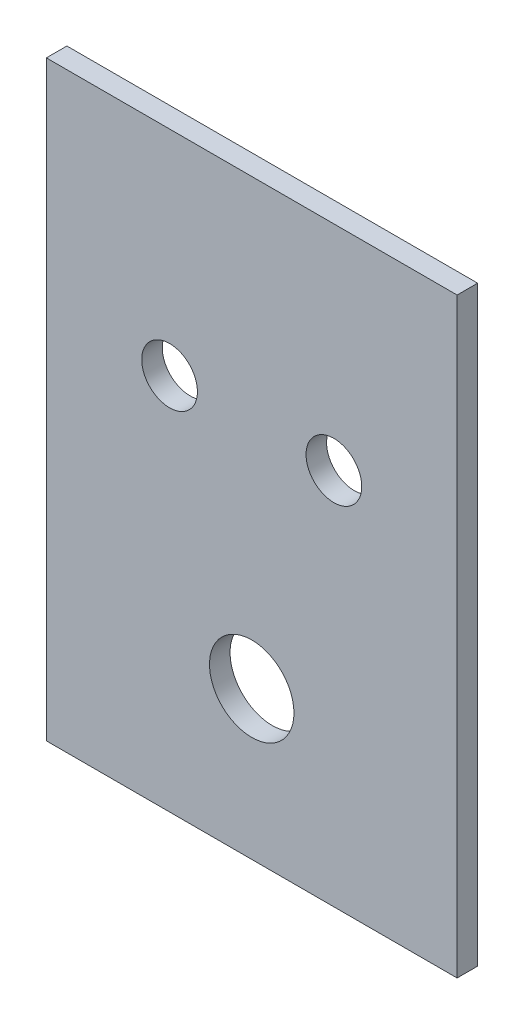
ISO-10303-21;
HEADER;
FILE_DESCRIPTION(('STEP AP214'),'2;1');
FILE_NAME('part.step','',(''),(''),'','','');
FILE_SCHEMA(('AUTOMOTIVE_DESIGN { 1 0 10303 214 1 1 1 1 }'));
ENDSEC;
DATA;
#1=APPLICATION_CONTEXT('core data for automotive mechanical design processes');
#2=APPLICATION_PROTOCOL_DEFINITION('international standard','automotive_design',2000,#1);
#3=PRODUCT_CONTEXT('',#1,'mechanical');
#4=PRODUCT('Part','Part','',(#3));
#5=PRODUCT_RELATED_PRODUCT_CATEGORY('part','',(#4));
#6=PRODUCT_DEFINITION_FORMATION('','',#4);
#7=PRODUCT_DEFINITION_CONTEXT('part definition',#1,'design');
#8=PRODUCT_DEFINITION('design','',#6,#7);
#9=PRODUCT_DEFINITION_SHAPE('','',#8);
#10=(LENGTH_UNIT() NAMED_UNIT(*) SI_UNIT(.MILLI.,.METRE.));
#11=(NAMED_UNIT(*) PLANE_ANGLE_UNIT() SI_UNIT($,.RADIAN.));
#12=(NAMED_UNIT(*) SI_UNIT($,.STERADIAN.) SOLID_ANGLE_UNIT());
#13=UNCERTAINTY_MEASURE_WITH_UNIT(LENGTH_MEASURE(1.E-05),#10,'distance_accuracy_value','');
#14=(GEOMETRIC_REPRESENTATION_CONTEXT(3) GLOBAL_UNCERTAINTY_ASSIGNED_CONTEXT((#13)) GLOBAL_UNIT_ASSIGNED_CONTEXT((#10,
#11,#12)) REPRESENTATION_CONTEXT('',''));
#15=CARTESIAN_POINT('',(0.,0.,0.));
#16=DIRECTION('',(0.,0.,1.));
#17=DIRECTION('',(1.,0.,0.));
#18=AXIS2_PLACEMENT_3D('',#15,#16,#17);
#19=CARTESIAN_POINT('',(31.75,0.,1.5875));
#20=DIRECTION('',(-1.,0.,0.));
#21=DIRECTION('',(0.,0.,1.));
#22=AXIS2_PLACEMENT_3D('',#19,#20,#21);
#23=PLANE('',#22);
#24=DIRECTION('',(0.,1.,0.));
#25=VECTOR('',#24,1.);
#26=CARTESIAN_POINT('',(31.75,0.,0.));
#27=LINE('',#26,#25);
#28=CARTESIAN_POINT('',(31.75,0.,0.));
#29=VERTEX_POINT('',#28);
#30=CARTESIAN_POINT('',(31.75,45.72,0.));
#31=VERTEX_POINT('',#30);
#32=EDGE_CURVE('E116',#29,#31,#27,.T.);
#33=ORIENTED_EDGE('',*,*,#32,.T.);
#34=DIRECTION('',(0.,0.,-1.));
#35=VECTOR('',#34,1.);
#36=CARTESIAN_POINT('',(31.75,45.72,1.5875));
#37=LINE('',#36,#35);
#38=CARTESIAN_POINT('',(31.75,45.72,1.5875));
#39=VERTEX_POINT('',#38);
#40=EDGE_CURVE('E11',#39,#31,#37,.T.);
#41=ORIENTED_EDGE('',*,*,#40,.F.);
#42=DIRECTION('',(0.,1.,0.));
#43=VECTOR('',#42,1.);
#44=CARTESIAN_POINT('',(31.75,0.,1.5875));
#45=LINE('',#44,#43);
#46=CARTESIAN_POINT('',(31.75,0.,1.5875));
#47=VERTEX_POINT('',#46);
#48=EDGE_CURVE('E83',#47,#39,#45,.T.);
#49=ORIENTED_EDGE('',*,*,#48,.F.);
#50=DIRECTION('',(0.,0.,-1.));
#51=VECTOR('',#50,1.);
#52=CARTESIAN_POINT('',(31.75,0.,1.5875));
#53=LINE('',#52,#51);
#54=EDGE_CURVE('E112',#47,#29,#53,.T.);
#55=ORIENTED_EDGE('',*,*,#54,.T.);
#56=EDGE_LOOP('',(#33,#41,#49,#55));
#57=FACE_BOUND('',#56,.T.);
#58=ADVANCED_FACE('F43',(#57),#23,.F.);
#59=CARTESIAN_POINT('',(0.,45.72,1.5875));
#60=DIRECTION('',(0.,1.,0.));
#61=DIRECTION('',(0.,0.,1.));
#62=AXIS2_PLACEMENT_3D('',#59,#60,#61);
#63=PLANE('',#62);
#64=DIRECTION('',(1.,0.,0.));
#65=VECTOR('',#64,1.);
#66=CARTESIAN_POINT('',(0.,45.72,0.));
#67=LINE('',#66,#65);
#68=CARTESIAN_POINT('',(0.,45.72,0.));
#69=VERTEX_POINT('',#68);
#70=EDGE_CURVE('E92',#69,#31,#67,.T.);
#71=ORIENTED_EDGE('',*,*,#70,.F.);
#72=DIRECTION('',(0.,0.,-1.));
#73=VECTOR('',#72,1.);
#74=CARTESIAN_POINT('',(0.,45.72,1.5875));
#75=LINE('',#74,#73);
#76=CARTESIAN_POINT('',(0.,45.72,1.5875));
#77=VERTEX_POINT('',#76);
#78=EDGE_CURVE('E52',#77,#69,#75,.T.);
#79=ORIENTED_EDGE('',*,*,#78,.F.);
#80=DIRECTION('',(1.,0.,0.));
#81=VECTOR('',#80,1.);
#82=CARTESIAN_POINT('',(0.,45.72,1.5875));
#83=LINE('',#82,#81);
#84=EDGE_CURVE('E90',#77,#39,#83,.T.);
#85=ORIENTED_EDGE('',*,*,#84,.T.);
#86=ORIENTED_EDGE('',*,*,#40,.T.);
#87=EDGE_LOOP('',(#71,#79,#85,#86));
#88=FACE_BOUND('',#87,.T.);
#89=ADVANCED_FACE('F89',(#88),#63,.T.);
#90=CARTESIAN_POINT('',(0.,0.,1.5875));
#91=DIRECTION('',(-1.,0.,0.));
#92=DIRECTION('',(0.,0.,1.));
#93=AXIS2_PLACEMENT_3D('',#90,#91,#92);
#94=PLANE('',#93);
#95=DIRECTION('',(0.,1.,0.));
#96=VECTOR('',#95,1.);
#97=CARTESIAN_POINT('',(0.,0.,0.));
#98=LINE('',#97,#96);
#99=CARTESIAN_POINT('',(0.,0.,0.));
#100=VERTEX_POINT('',#99);
#101=EDGE_CURVE('E120',#100,#69,#98,.T.);
#102=ORIENTED_EDGE('',*,*,#101,.F.);
#103=DIRECTION('',(0.,0.,-1.));
#104=VECTOR('',#103,1.);
#105=CARTESIAN_POINT('',(0.,0.,1.5875));
#106=LINE('',#105,#104);
#107=CARTESIAN_POINT('',(0.,0.,1.5875));
#108=VERTEX_POINT('',#107);
#109=EDGE_CURVE('E75',#108,#100,#106,.T.);
#110=ORIENTED_EDGE('',*,*,#109,.F.);
#111=DIRECTION('',(0.,1.,0.));
#112=VECTOR('',#111,1.);
#113=CARTESIAN_POINT('',(0.,0.,1.5875));
#114=LINE('',#113,#112);
#115=EDGE_CURVE('E99',#108,#77,#114,.T.);
#116=ORIENTED_EDGE('',*,*,#115,.T.);
#117=ORIENTED_EDGE('',*,*,#78,.T.);
#118=EDGE_LOOP('',(#102,#110,#116,#117));
#119=FACE_BOUND('',#118,.T.);
#120=ADVANCED_FACE('F101',(#119),#94,.T.);
#121=CARTESIAN_POINT('',(22.225,29.21,1.5875));
#122=DIRECTION('',(0.,0.,-1.));
#123=DIRECTION('',(-1.,0.,0.));
#124=AXIS2_PLACEMENT_3D('',#121,#122,#123);
#125=CYLINDRICAL_SURFACE('',#124,2.15265);
#126=CARTESIAN_POINT('',(22.225,29.21,1.5875));
#127=DIRECTION('',(0.,0.,1.));
#128=DIRECTION('',(1.,0.,0.));
#129=AXIS2_PLACEMENT_3D('',#126,#127,#128);
#130=CIRCLE('',#129,2.15265);
#131=CARTESIAN_POINT('',(24.37765,29.21,1.5875));
#132=VERTEX_POINT('',#131);
#133=EDGE_CURVE('E103',#132,#132,#130,.T.);
#134=ORIENTED_EDGE('',*,*,#133,.T.);
#135=EDGE_LOOP('',(#134));
#136=FACE_BOUND('',#135,.T.);
#137=CARTESIAN_POINT('',(22.225,29.21,0.));
#138=DIRECTION('',(0.,0.,1.));
#139=DIRECTION('',(1.,0.,0.));
#140=AXIS2_PLACEMENT_3D('',#137,#138,#139);
#141=CIRCLE('',#140,2.15265);
#142=CARTESIAN_POINT('',(24.37765,29.21,0.));
#143=VERTEX_POINT('',#142);
#144=EDGE_CURVE('E123',#143,#143,#141,.T.);
#145=ORIENTED_EDGE('',*,*,#144,.F.);
#146=EDGE_LOOP('',(#145));
#147=FACE_BOUND('',#146,.T.);
#148=ADVANCED_FACE('F164',(#136,#147),#125,.F.);
#149=CARTESIAN_POINT('',(0.,0.,1.5875));
#150=DIRECTION('',(0.,1.,0.));
#151=DIRECTION('',(0.,0.,1.));
#152=AXIS2_PLACEMENT_3D('',#149,#150,#151);
#153=PLANE('',#152);
#154=DIRECTION('',(1.,0.,0.));
#155=VECTOR('',#154,1.);
#156=CARTESIAN_POINT('',(0.,0.,0.));
#157=LINE('',#156,#155);
#158=EDGE_CURVE('E78',#100,#29,#157,.T.);
#159=ORIENTED_EDGE('',*,*,#158,.T.);
#160=ORIENTED_EDGE('',*,*,#54,.F.);
#161=DIRECTION('',(1.,0.,0.));
#162=VECTOR('',#161,1.);
#163=CARTESIAN_POINT('',(0.,0.,1.5875));
#164=LINE('',#163,#162);
#165=EDGE_CURVE('E60',#108,#47,#164,.T.);
#166=ORIENTED_EDGE('',*,*,#165,.F.);
#167=ORIENTED_EDGE('',*,*,#109,.T.);
#168=EDGE_LOOP('',(#159,#160,#166,#167));
#169=FACE_BOUND('',#168,.T.);
#170=ADVANCED_FACE('F153',(#169),#153,.F.);
#171=CARTESIAN_POINT('',(15.875,11.43,1.5875));
#172=DIRECTION('',(0.,0.,-1.));
#173=DIRECTION('',(-1.,0.,0.));
#174=AXIS2_PLACEMENT_3D('',#171,#172,#173);
#175=CYLINDRICAL_SURFACE('',#174,3.2639);
#176=CARTESIAN_POINT('',(15.875,11.43,1.5875));
#177=DIRECTION('',(0.,0.,1.));
#178=DIRECTION('',(1.,0.,0.));
#179=AXIS2_PLACEMENT_3D('',#176,#177,#178);
#180=CIRCLE('',#179,3.2639);
#181=CARTESIAN_POINT('',(19.1389,11.43,1.5875));
#182=VERTEX_POINT('',#181);
#183=EDGE_CURVE('E129',#182,#182,#180,.T.);
#184=ORIENTED_EDGE('',*,*,#183,.T.);
#185=EDGE_LOOP('',(#184));
#186=FACE_BOUND('',#185,.T.);
#187=CARTESIAN_POINT('',(15.875,11.43,0.));
#188=DIRECTION('',(0.,0.,1.));
#189=DIRECTION('',(1.,0.,0.));
#190=AXIS2_PLACEMENT_3D('',#187,#188,#189);
#191=CIRCLE('',#190,3.2639);
#192=CARTESIAN_POINT('',(19.1389,11.43,0.));
#193=VERTEX_POINT('',#192);
#194=EDGE_CURVE('E113',#193,#193,#191,.T.);
#195=ORIENTED_EDGE('',*,*,#194,.F.);
#196=EDGE_LOOP('',(#195));
#197=FACE_BOUND('',#196,.T.);
#198=ADVANCED_FACE('F45',(#186,#197),#175,.F.);
#199=CARTESIAN_POINT('',(9.525,29.21,1.5875));
#200=DIRECTION('',(0.,0.,-1.));
#201=DIRECTION('',(-1.,0.,0.));
#202=AXIS2_PLACEMENT_3D('',#199,#200,#201);
#203=CYLINDRICAL_SURFACE('',#202,2.15265);
#204=CARTESIAN_POINT('',(9.525,29.21,1.5875));
#205=DIRECTION('',(0.,0.,1.));
#206=DIRECTION('',(1.,0.,0.));
#207=AXIS2_PLACEMENT_3D('',#204,#205,#206);
#208=CIRCLE('',#207,2.15265);
#209=CARTESIAN_POINT('',(11.67765,29.21,1.5875));
#210=VERTEX_POINT('',#209);
#211=EDGE_CURVE('E109',#210,#210,#208,.T.);
#212=ORIENTED_EDGE('',*,*,#211,.T.);
#213=EDGE_LOOP('',(#212));
#214=FACE_BOUND('',#213,.T.);
#215=CARTESIAN_POINT('',(9.525,29.21,0.));
#216=DIRECTION('',(0.,0.,1.));
#217=DIRECTION('',(1.,0.,0.));
#218=AXIS2_PLACEMENT_3D('',#215,#216,#217);
#219=CIRCLE('',#218,2.15265);
#220=CARTESIAN_POINT('',(11.67765,29.21,0.));
#221=VERTEX_POINT('',#220);
#222=EDGE_CURVE('E126',#221,#221,#219,.T.);
#223=ORIENTED_EDGE('',*,*,#222,.F.);
#224=EDGE_LOOP('',(#223));
#225=FACE_BOUND('',#224,.T.);
#226=ADVANCED_FACE('F143',(#214,#225),#203,.F.);
#227=CARTESIAN_POINT('',(0.,0.,1.5875));
#228=DIRECTION('',(0.,0.,1.));
#229=DIRECTION('',(1.,0.,0.));
#230=AXIS2_PLACEMENT_3D('',#227,#228,#229);
#231=PLANE('',#230);
#232=ORIENTED_EDGE('',*,*,#183,.F.);
#233=EDGE_LOOP('',(#232));
#234=FACE_BOUND('',#233,.T.);
#235=ORIENTED_EDGE('',*,*,#48,.T.);
#236=ORIENTED_EDGE('',*,*,#84,.F.);
#237=ORIENTED_EDGE('',*,*,#115,.F.);
#238=ORIENTED_EDGE('',*,*,#165,.T.);
#239=EDGE_LOOP('',(#235,#236,#237,#238));
#240=FACE_BOUND('',#239,.T.);
#241=ORIENTED_EDGE('',*,*,#133,.F.);
#242=EDGE_LOOP('',(#241));
#243=FACE_BOUND('',#242,.T.);
#244=ORIENTED_EDGE('',*,*,#211,.F.);
#245=EDGE_LOOP('',(#244));
#246=FACE_BOUND('',#245,.T.);
#247=ADVANCED_FACE('F97',(#234,#240,#243,#246),#231,.T.);
#248=CARTESIAN_POINT('',(0.,0.,0.));
#249=DIRECTION('',(0.,0.,1.));
#250=DIRECTION('',(1.,0.,0.));
#251=AXIS2_PLACEMENT_3D('',#248,#249,#250);
#252=PLANE('',#251);
#253=ORIENTED_EDGE('',*,*,#194,.T.);
#254=EDGE_LOOP('',(#253));
#255=FACE_BOUND('',#254,.T.);
#256=ORIENTED_EDGE('',*,*,#32,.F.);
#257=ORIENTED_EDGE('',*,*,#158,.F.);
#258=ORIENTED_EDGE('',*,*,#101,.T.);
#259=ORIENTED_EDGE('',*,*,#70,.T.);
#260=EDGE_LOOP('',(#256,#257,#258,#259));
#261=FACE_BOUND('',#260,.T.);
#262=ORIENTED_EDGE('',*,*,#144,.T.);
#263=EDGE_LOOP('',(#262));
#264=FACE_BOUND('',#263,.T.);
#265=ORIENTED_EDGE('',*,*,#222,.T.);
#266=EDGE_LOOP('',(#265));
#267=FACE_BOUND('',#266,.T.);
#268=ADVANCED_FACE('F134',(#255,#261,#264,#267),#252,.F.);
#269=CLOSED_SHELL('',(#58,#89,#120,#148,#170,#198,#226,#247,#268));
#270=MANIFOLD_SOLID_BREP('B2',#269);
#271=ADVANCED_BREP_SHAPE_REPRESENTATION('',(#18,#270),#14);
#272=SHAPE_DEFINITION_REPRESENTATION(#9,#271);
ENDSEC;
END-ISO-10303-21;
